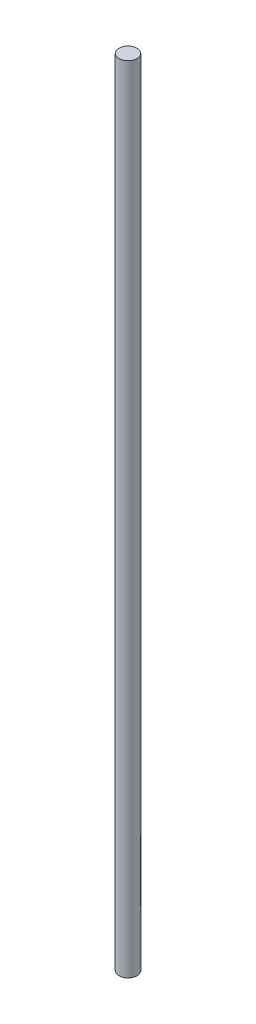
ISO-10303-21;
HEADER;
FILE_DESCRIPTION(('STEP AP214'),'2;1');
FILE_NAME('part.step','',(''),(''),'','','');
FILE_SCHEMA(('AUTOMOTIVE_DESIGN { 1 0 10303 214 1 1 1 1 }'));
ENDSEC;
DATA;
#1=APPLICATION_CONTEXT('core data for automotive mechanical design processes');
#2=APPLICATION_PROTOCOL_DEFINITION('international standard','automotive_design',2000,#1);
#3=PRODUCT_CONTEXT('',#1,'mechanical');
#4=PRODUCT('Part','Part','',(#3));
#5=PRODUCT_RELATED_PRODUCT_CATEGORY('part','',(#4));
#6=PRODUCT_DEFINITION_FORMATION('','',#4);
#7=PRODUCT_DEFINITION_CONTEXT('part definition',#1,'design');
#8=PRODUCT_DEFINITION('design','',#6,#7);
#9=PRODUCT_DEFINITION_SHAPE('','',#8);
#10=(LENGTH_UNIT() NAMED_UNIT(*) SI_UNIT(.MILLI.,.METRE.));
#11=(NAMED_UNIT(*) PLANE_ANGLE_UNIT() SI_UNIT($,.RADIAN.));
#12=(NAMED_UNIT(*) SI_UNIT($,.STERADIAN.) SOLID_ANGLE_UNIT());
#13=UNCERTAINTY_MEASURE_WITH_UNIT(LENGTH_MEASURE(1.E-05),#10,'distance_accuracy_value','');
#14=(GEOMETRIC_REPRESENTATION_CONTEXT(3) GLOBAL_UNCERTAINTY_ASSIGNED_CONTEXT((#13)) GLOBAL_UNIT_ASSIGNED_CONTEXT((#10,
#11,#12)) REPRESENTATION_CONTEXT('',''));
#15=CARTESIAN_POINT('',(0.,0.,0.));
#16=DIRECTION('',(0.,0.,1.));
#17=DIRECTION('',(1.,0.,0.));
#18=AXIS2_PLACEMENT_3D('',#15,#16,#17);
#19=CARTESIAN_POINT('',(0.,139.7,0.));
#20=DIRECTION('',(0.,-1.,0.));
#21=DIRECTION('',(0.,0.,-1.));
#22=AXIS2_PLACEMENT_3D('',#19,#20,#21);
#23=CYLINDRICAL_SURFACE('',#22,3.175);
#24=CARTESIAN_POINT('',(0.,139.7,0.));
#25=DIRECTION('',(0.,1.,0.));
#26=DIRECTION('',(0.,0.,1.));
#27=AXIS2_PLACEMENT_3D('',#24,#25,#26);
#28=CIRCLE('',#27,3.175);
#29=CARTESIAN_POINT('',(0.,139.7,3.175));
#30=VERTEX_POINT('',#29);
#31=EDGE_CURVE('E10',#30,#30,#28,.T.);
#32=ORIENTED_EDGE('',*,*,#31,.F.);
#33=EDGE_LOOP('',(#32));
#34=FACE_BOUND('',#33,.T.);
#35=CARTESIAN_POINT('',(0.,-139.7,0.));
#36=DIRECTION('',(0.,1.,0.));
#37=DIRECTION('',(0.,0.,1.));
#38=AXIS2_PLACEMENT_3D('',#35,#36,#37);
#39=CIRCLE('',#38,3.175);
#40=CARTESIAN_POINT('',(0.,-139.7,3.175));
#41=VERTEX_POINT('',#40);
#42=EDGE_CURVE('E40',#41,#41,#39,.T.);
#43=ORIENTED_EDGE('',*,*,#42,.T.);
#44=EDGE_LOOP('',(#43));
#45=FACE_BOUND('',#44,.T.);
#46=ADVANCED_FACE('F37',(#34,#45),#23,.T.);
#47=CARTESIAN_POINT('',(0.,139.7,0.));
#48=DIRECTION('',(0.,1.,0.));
#49=DIRECTION('',(0.,0.,1.));
#50=AXIS2_PLACEMENT_3D('',#47,#48,#49);
#51=PLANE('',#50);
#52=ORIENTED_EDGE('',*,*,#31,.T.);
#53=EDGE_LOOP('',(#52));
#54=FACE_BOUND('',#53,.T.);
#55=ADVANCED_FACE('F52',(#54),#51,.T.);
#56=CARTESIAN_POINT('',(0.,-139.7,0.));
#57=DIRECTION('',(0.,1.,0.));
#58=DIRECTION('',(0.,0.,1.));
#59=AXIS2_PLACEMENT_3D('',#56,#57,#58);
#60=PLANE('',#59);
#61=ORIENTED_EDGE('',*,*,#42,.F.);
#62=EDGE_LOOP('',(#61));
#63=FACE_BOUND('',#62,.T.);
#64=ADVANCED_FACE('F50',(#63),#60,.F.);
#65=CLOSED_SHELL('',(#46,#55,#64));
#66=MANIFOLD_SOLID_BREP('B2',#65);
#67=ADVANCED_BREP_SHAPE_REPRESENTATION('',(#18,#66),#14);
#68=SHAPE_DEFINITION_REPRESENTATION(#9,#67);
ENDSEC;
END-ISO-10303-21;
